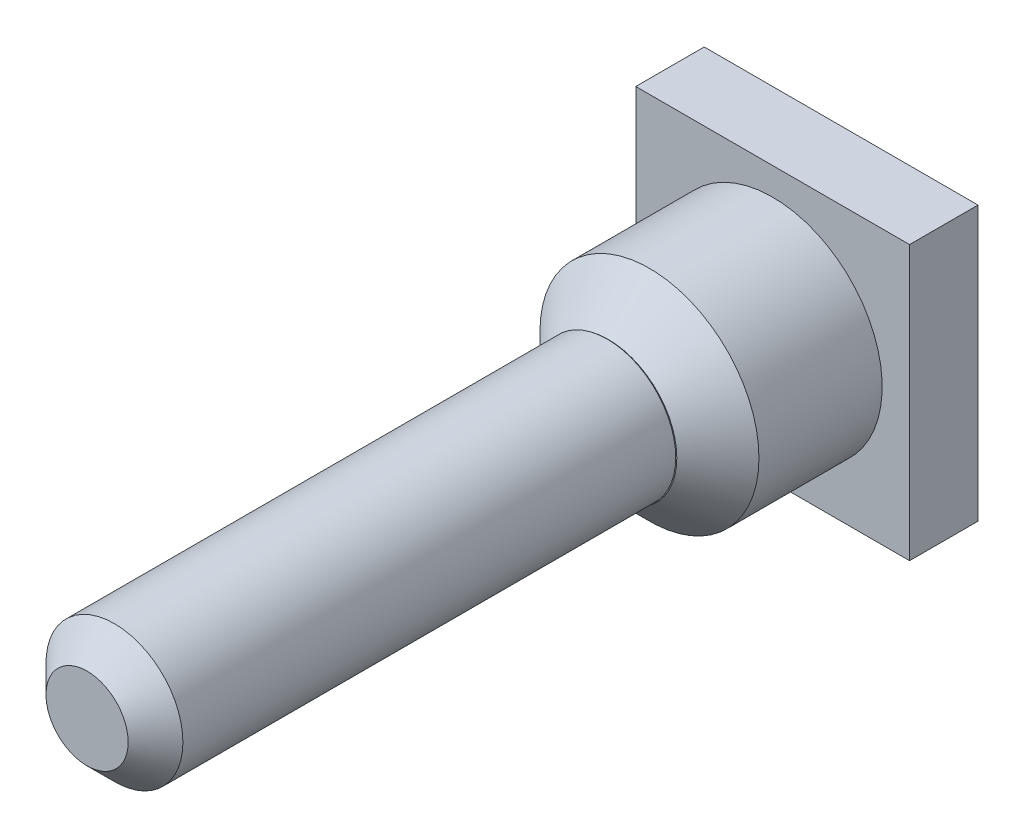
ISO-10303-21;
HEADER;
FILE_DESCRIPTION(('STEP AP214'),'2;1');
FILE_NAME('part.step','',(''),(''),'','','');
FILE_SCHEMA(('AUTOMOTIVE_DESIGN { 1 0 10303 214 1 1 1 1 }'));
ENDSEC;
DATA;
#1=APPLICATION_CONTEXT('core data for automotive mechanical design processes');
#2=APPLICATION_PROTOCOL_DEFINITION('international standard','automotive_design',2000,#1);
#3=PRODUCT_CONTEXT('',#1,'mechanical');
#4=PRODUCT('Part','Part','',(#3));
#5=PRODUCT_RELATED_PRODUCT_CATEGORY('part','',(#4));
#6=PRODUCT_DEFINITION_FORMATION('','',#4);
#7=PRODUCT_DEFINITION_CONTEXT('part definition',#1,'design');
#8=PRODUCT_DEFINITION('design','',#6,#7);
#9=PRODUCT_DEFINITION_SHAPE('','',#8);
#10=(LENGTH_UNIT() NAMED_UNIT(*) SI_UNIT(.MILLI.,.METRE.));
#11=(NAMED_UNIT(*) PLANE_ANGLE_UNIT() SI_UNIT($,.RADIAN.));
#12=(NAMED_UNIT(*) SI_UNIT($,.STERADIAN.) SOLID_ANGLE_UNIT());
#13=UNCERTAINTY_MEASURE_WITH_UNIT(LENGTH_MEASURE(1.E-05),#10,'distance_accuracy_value','');
#14=(GEOMETRIC_REPRESENTATION_CONTEXT(3) GLOBAL_UNCERTAINTY_ASSIGNED_CONTEXT((#13)) GLOBAL_UNIT_ASSIGNED_CONTEXT((#10,
#11,#12)) REPRESENTATION_CONTEXT('',''));
#15=CARTESIAN_POINT('',(0.,0.,0.));
#16=DIRECTION('',(0.,0.,1.));
#17=DIRECTION('',(1.,0.,0.));
#18=AXIS2_PLACEMENT_3D('',#15,#16,#17);
#19=CARTESIAN_POINT('',(0.,20.,5.));
#20=DIRECTION('',(0.,0.,-1.));
#21=DIRECTION('',(-1.,0.,0.));
#22=AXIS2_PLACEMENT_3D('',#19,#20,#21);
#23=PLANE('',#22);
#24=DIRECTION('',(0.,-1.,0.));
#25=VECTOR('',#24,1.);
#26=CARTESIAN_POINT('',(0.,0.,5.));
#27=LINE('',#26,#25);
#28=CARTESIAN_POINT('',(0.,20.,5.));
#29=VERTEX_POINT('',#28);
#30=CARTESIAN_POINT('',(0.,0.,5.));
#31=VERTEX_POINT('',#30);
#32=EDGE_CURVE('E89',#29,#31,#27,.T.);
#33=ORIENTED_EDGE('',*,*,#32,.T.);
#34=DIRECTION('',(1.,0.,0.));
#35=VECTOR('',#34,1.);
#36=CARTESIAN_POINT('',(0.,0.,5.));
#37=LINE('',#36,#35);
#38=CARTESIAN_POINT('',(20.,0.,5.));
#39=VERTEX_POINT('',#38);
#40=EDGE_CURVE('E91',#31,#39,#37,.T.);
#41=ORIENTED_EDGE('',*,*,#40,.T.);
#42=DIRECTION('',(0.,1.,0.));
#43=VECTOR('',#42,1.);
#44=CARTESIAN_POINT('',(20.,0.,5.));
#45=LINE('',#44,#43);
#46=CARTESIAN_POINT('',(20.,20.,5.));
#47=VERTEX_POINT('',#46);
#48=EDGE_CURVE('E93',#39,#47,#45,.T.);
#49=ORIENTED_EDGE('',*,*,#48,.T.);
#50=DIRECTION('',(-1.,0.,0.));
#51=VECTOR('',#50,1.);
#52=CARTESIAN_POINT('',(0.,20.,5.));
#53=LINE('',#52,#51);
#54=EDGE_CURVE('E38',#47,#29,#53,.T.);
#55=ORIENTED_EDGE('',*,*,#54,.T.);
#56=EDGE_LOOP('',(#33,#41,#49,#55));
#57=FACE_BOUND('',#56,.T.);
#58=CARTESIAN_POINT('',(10.,10.,5.));
#59=DIRECTION('',(0.,0.,-1.));
#60=DIRECTION('',(-1.,0.,0.));
#61=AXIS2_PLACEMENT_3D('',#58,#59,#60);
#62=CIRCLE('',#61,8.);
#63=CARTESIAN_POINT('',(2.,10.,5.));
#64=VERTEX_POINT('',#63);
#65=EDGE_CURVE('E73',#64,#64,#62,.F.);
#66=ORIENTED_EDGE('',*,*,#65,.F.);
#67=EDGE_LOOP('',(#66));
#68=FACE_BOUND('',#67,.T.);
#69=ADVANCED_FACE('F16',(#57,#68),#23,.F.);
#70=CARTESIAN_POINT('',(0.,0.,5.));
#71=DIRECTION('',(1.,0.,0.));
#72=DIRECTION('',(0.,0.,-1.));
#73=AXIS2_PLACEMENT_3D('',#70,#71,#72);
#74=PLANE('',#73);
#75=DIRECTION('',(0.,-1.,0.));
#76=VECTOR('',#75,1.);
#77=CARTESIAN_POINT('',(0.,0.,0.));
#78=LINE('',#77,#76);
#79=CARTESIAN_POINT('',(0.,20.,0.));
#80=VERTEX_POINT('',#79);
#81=CARTESIAN_POINT('',(0.,0.,0.));
#82=VERTEX_POINT('',#81);
#83=EDGE_CURVE('E79',#80,#82,#78,.T.);
#84=ORIENTED_EDGE('',*,*,#83,.T.);
#85=DIRECTION('',(0.,0.,-1.));
#86=VECTOR('',#85,1.);
#87=CARTESIAN_POINT('',(0.,0.,5.));
#88=LINE('',#87,#86);
#89=EDGE_CURVE('E105',#31,#82,#88,.T.);
#90=ORIENTED_EDGE('',*,*,#89,.F.);
#91=ORIENTED_EDGE('',*,*,#32,.F.);
#92=DIRECTION('',(0.,0.,-1.));
#93=VECTOR('',#92,1.);
#94=CARTESIAN_POINT('',(0.,20.,5.));
#95=LINE('',#94,#93);
#96=EDGE_CURVE('E96',#29,#80,#95,.T.);
#97=ORIENTED_EDGE('',*,*,#96,.T.);
#98=EDGE_LOOP('',(#84,#90,#91,#97));
#99=FACE_BOUND('',#98,.T.);
#100=ADVANCED_FACE('F18',(#99),#74,.F.);
#101=CARTESIAN_POINT('',(0.,0.,5.));
#102=DIRECTION('',(0.,1.,0.));
#103=DIRECTION('',(0.,0.,1.));
#104=AXIS2_PLACEMENT_3D('',#101,#102,#103);
#105=PLANE('',#104);
#106=DIRECTION('',(1.,0.,0.));
#107=VECTOR('',#106,1.);
#108=CARTESIAN_POINT('',(0.,0.,0.));
#109=LINE('',#108,#107);
#110=CARTESIAN_POINT('',(20.,0.,0.));
#111=VERTEX_POINT('',#110);
#112=EDGE_CURVE('E81',#82,#111,#109,.T.);
#113=ORIENTED_EDGE('',*,*,#112,.T.);
#114=DIRECTION('',(0.,0.,-1.));
#115=VECTOR('',#114,1.);
#116=CARTESIAN_POINT('',(20.,0.,5.));
#117=LINE('',#116,#115);
#118=EDGE_CURVE('E102',#39,#111,#117,.T.);
#119=ORIENTED_EDGE('',*,*,#118,.F.);
#120=ORIENTED_EDGE('',*,*,#40,.F.);
#121=ORIENTED_EDGE('',*,*,#89,.T.);
#122=EDGE_LOOP('',(#113,#119,#120,#121));
#123=FACE_BOUND('',#122,.T.);
#124=ADVANCED_FACE('F132',(#123),#105,.F.);
#125=CARTESIAN_POINT('',(20.,0.,5.));
#126=DIRECTION('',(-1.,0.,0.));
#127=DIRECTION('',(0.,-1.,0.));
#128=AXIS2_PLACEMENT_3D('',#125,#126,#127);
#129=PLANE('',#128);
#130=DIRECTION('',(0.,1.,0.));
#131=VECTOR('',#130,1.);
#132=CARTESIAN_POINT('',(20.,0.,0.));
#133=LINE('',#132,#131);
#134=CARTESIAN_POINT('',(20.,20.,0.));
#135=VERTEX_POINT('',#134);
#136=EDGE_CURVE('E85',#111,#135,#133,.T.);
#137=ORIENTED_EDGE('',*,*,#136,.T.);
#138=DIRECTION('',(0.,0.,-1.));
#139=VECTOR('',#138,1.);
#140=CARTESIAN_POINT('',(20.,20.,5.));
#141=LINE('',#140,#139);
#142=EDGE_CURVE('E99',#47,#135,#141,.T.);
#143=ORIENTED_EDGE('',*,*,#142,.F.);
#144=ORIENTED_EDGE('',*,*,#48,.F.);
#145=ORIENTED_EDGE('',*,*,#118,.T.);
#146=EDGE_LOOP('',(#137,#143,#144,#145));
#147=FACE_BOUND('',#146,.T.);
#148=ADVANCED_FACE('F142',(#147),#129,.F.);
#149=CARTESIAN_POINT('',(0.,20.,5.));
#150=DIRECTION('',(0.,-1.,0.));
#151=DIRECTION('',(0.,0.,-1.));
#152=AXIS2_PLACEMENT_3D('',#149,#150,#151);
#153=PLANE('',#152);
#154=DIRECTION('',(-1.,0.,0.));
#155=VECTOR('',#154,1.);
#156=CARTESIAN_POINT('',(0.,20.,0.));
#157=LINE('',#156,#155);
#158=EDGE_CURVE('E87',#135,#80,#157,.T.);
#159=ORIENTED_EDGE('',*,*,#158,.T.);
#160=ORIENTED_EDGE('',*,*,#96,.F.);
#161=ORIENTED_EDGE('',*,*,#54,.F.);
#162=ORIENTED_EDGE('',*,*,#142,.T.);
#163=EDGE_LOOP('',(#159,#160,#161,#162));
#164=FACE_BOUND('',#163,.T.);
#165=ADVANCED_FACE('F139',(#164),#153,.F.);
#166=CARTESIAN_POINT('',(0.,20.,0.));
#167=DIRECTION('',(0.,0.,-1.));
#168=DIRECTION('',(-1.,0.,0.));
#169=AXIS2_PLACEMENT_3D('',#166,#167,#168);
#170=PLANE('',#169);
#171=ORIENTED_EDGE('',*,*,#83,.F.);
#172=ORIENTED_EDGE('',*,*,#158,.F.);
#173=ORIENTED_EDGE('',*,*,#136,.F.);
#174=ORIENTED_EDGE('',*,*,#112,.F.);
#175=EDGE_LOOP('',(#171,#172,#173,#174));
#176=FACE_BOUND('',#175,.T.);
#177=ADVANCED_FACE('F137',(#176),#170,.T.);
#178=CARTESIAN_POINT('',(10.,10.,17.));
#179=DIRECTION('',(0.,0.,-1.));
#180=DIRECTION('',(-1.,0.,0.));
#181=AXIS2_PLACEMENT_3D('',#178,#179,#180);
#182=CYLINDRICAL_SURFACE('',#181,8.);
#183=CARTESIAN_POINT('',(10.,10.,14.));
#184=DIRECTION('',(0.,0.,1.));
#185=DIRECTION('',(1.,0.,0.));
#186=AXIS2_PLACEMENT_3D('',#183,#184,#185);
#187=CIRCLE('',#186,8.);
#188=CARTESIAN_POINT('',(18.,10.,14.));
#189=VERTEX_POINT('',#188);
#190=EDGE_CURVE('E70',#189,#189,#187,.F.);
#191=ORIENTED_EDGE('',*,*,#190,.T.);
#192=EDGE_LOOP('',(#191));
#193=FACE_BOUND('',#192,.T.);
#194=ORIENTED_EDGE('',*,*,#65,.T.);
#195=EDGE_LOOP('',(#194));
#196=FACE_BOUND('',#195,.T.);
#197=ADVANCED_FACE('F160',(#193,#196),#182,.T.);
#198=CARTESIAN_POINT('',(10.,10.,17.));
#199=DIRECTION('',(0.,0.,1.));
#200=DIRECTION('',(1.,0.,0.));
#201=AXIS2_PLACEMENT_3D('',#198,#199,#200);
#202=PLANE('',#201);
#203=CARTESIAN_POINT('',(9.920116194626,9.98002904865656,17.));
#204=DIRECTION('',(0.,0.,1.));
#205=DIRECTION('',(1.,0.,0.));
#206=AXIS2_PLACEMENT_3D('',#203,#204,#205);
#207=CIRCLE('',#206,5.);
#208=CARTESIAN_POINT('',(11.1726951104217,5.13946647187852,17.));
#209=VERTEX_POINT('',#208);
#210=CARTESIAN_POINT('',(8.74742108420387,14.8405625767779,17.));
#211=VERTEX_POINT('',#210);
#212=EDGE_CURVE('E30',#209,#211,#207,.T.);
#213=ORIENTED_EDGE('',*,*,#212,.F.);
#214=CARTESIAN_POINT('',(10.,10.,17.));
#215=DIRECTION('',(0.,0.,1.));
#216=DIRECTION('',(1.,0.,0.));
#217=AXIS2_PLACEMENT_3D('',#214,#215,#216);
#218=CIRCLE('',#217,5.);
#219=EDGE_CURVE('E66',#209,#211,#218,.T.);
#220=ORIENTED_EDGE('',*,*,#219,.T.);
#221=EDGE_LOOP('',(#213,#220));
#222=FACE_BOUND('',#221,.T.);
#223=ADVANCED_FACE('F72',(#222),#202,.T.);
#224=CARTESIAN_POINT('',(10.,10.,17.));
#225=DIRECTION('',(0.,0.,-1.));
#226=DIRECTION('',(-1.,0.,0.));
#227=AXIS2_PLACEMENT_3D('',#224,#225,#226);
#228=CONICAL_SURFACE('',#227,5.,0.785398163397447);
#229=ORIENTED_EDGE('',*,*,#190,.F.);
#230=EDGE_LOOP('',(#229));
#231=FACE_BOUND('',#230,.T.);
#232=EDGE_CURVE('E64',#211,#209,#218,.T.);
#233=ORIENTED_EDGE('',*,*,#232,.F.);
#234=ORIENTED_EDGE('',*,*,#219,.F.);
#235=EDGE_LOOP('',(#233,#234));
#236=FACE_BOUND('',#235,.T.);
#237=ADVANCED_FACE('F65',(#231,#236),#228,.T.);
#238=CARTESIAN_POINT('',(9.920116194626,9.98002904865656,17.));
#239=DIRECTION('',(0.,0.,1.));
#240=DIRECTION('',(1.,0.,0.));
#241=AXIS2_PLACEMENT_3D('',#238,#239,#240);
#242=PLANE('',#241);
#243=EDGE_CURVE('E76',#211,#209,#207,.T.);
#244=ORIENTED_EDGE('',*,*,#243,.F.);
#245=ORIENTED_EDGE('',*,*,#232,.T.);
#246=EDGE_LOOP('',(#244,#245));
#247=FACE_BOUND('',#246,.T.);
#248=ADVANCED_FACE('F78',(#247),#242,.F.);
#249=CARTESIAN_POINT('',(9.920116194626,9.98002904865656,55.));
#250=DIRECTION('',(0.,0.,-1.));
#251=DIRECTION('',(-1.,0.,0.));
#252=AXIS2_PLACEMENT_3D('',#249,#250,#251);
#253=CYLINDRICAL_SURFACE('',#252,5.);
#254=CARTESIAN_POINT('',(9.920116194626,9.98002904865656,53.));
#255=DIRECTION('',(0.,0.,1.));
#256=DIRECTION('',(1.,0.,0.));
#257=AXIS2_PLACEMENT_3D('',#254,#255,#256);
#258=CIRCLE('',#257,5.);
#259=CARTESIAN_POINT('',(14.920116194626,9.98002904865656,53.));
#260=VERTEX_POINT('',#259);
#261=EDGE_CURVE('E11',#260,#260,#258,.F.);
#262=ORIENTED_EDGE('',*,*,#261,.T.);
#263=EDGE_LOOP('',(#262));
#264=FACE_BOUND('',#263,.T.);
#265=ORIENTED_EDGE('',*,*,#243,.T.);
#266=ORIENTED_EDGE('',*,*,#212,.T.);
#267=EDGE_LOOP('',(#265,#266));
#268=FACE_BOUND('',#267,.T.);
#269=ADVANCED_FACE('F75',(#264,#268),#253,.T.);
#270=CARTESIAN_POINT('',(9.920116194626,9.98002904865656,55.));
#271=DIRECTION('',(0.,0.,1.));
#272=DIRECTION('',(1.,0.,0.));
#273=AXIS2_PLACEMENT_3D('',#270,#271,#272);
#274=PLANE('',#273);
#275=CARTESIAN_POINT('',(9.920116194626,9.98002904865656,55.));
#276=DIRECTION('',(0.,0.,1.));
#277=DIRECTION('',(1.,0.,0.));
#278=AXIS2_PLACEMENT_3D('',#275,#276,#277);
#279=CIRCLE('',#278,3.);
#280=CARTESIAN_POINT('',(12.920116194626,9.98002904865656,55.));
#281=VERTEX_POINT('',#280);
#282=EDGE_CURVE('E24',#281,#281,#279,.T.);
#283=ORIENTED_EDGE('',*,*,#282,.T.);
#284=EDGE_LOOP('',(#283));
#285=FACE_BOUND('',#284,.T.);
#286=ADVANCED_FACE('F114',(#285),#274,.T.);
#287=CARTESIAN_POINT('',(9.920116194626,9.98002904865656,55.));
#288=DIRECTION('',(0.,0.,-1.));
#289=DIRECTION('',(-1.,0.,0.));
#290=AXIS2_PLACEMENT_3D('',#287,#288,#289);
#291=CONICAL_SURFACE('',#290,3.,0.785398163397446);
#292=ORIENTED_EDGE('',*,*,#261,.F.);
#293=EDGE_LOOP('',(#292));
#294=FACE_BOUND('',#293,.T.);
#295=ORIENTED_EDGE('',*,*,#282,.F.);
#296=EDGE_LOOP('',(#295));
#297=FACE_BOUND('',#296,.T.);
#298=ADVANCED_FACE('F116',(#294,#297),#291,.T.);
#299=CLOSED_SHELL('',(#69,#100,#124,#148,#165,#177,#197,#223,#237,#248,#269,#286,#298));
#300=MANIFOLD_SOLID_BREP('B1',#299);
#301=ADVANCED_BREP_SHAPE_REPRESENTATION('',(#18,#300),#14);
#302=SHAPE_DEFINITION_REPRESENTATION(#9,#301);
ENDSEC;
END-ISO-10303-21;
